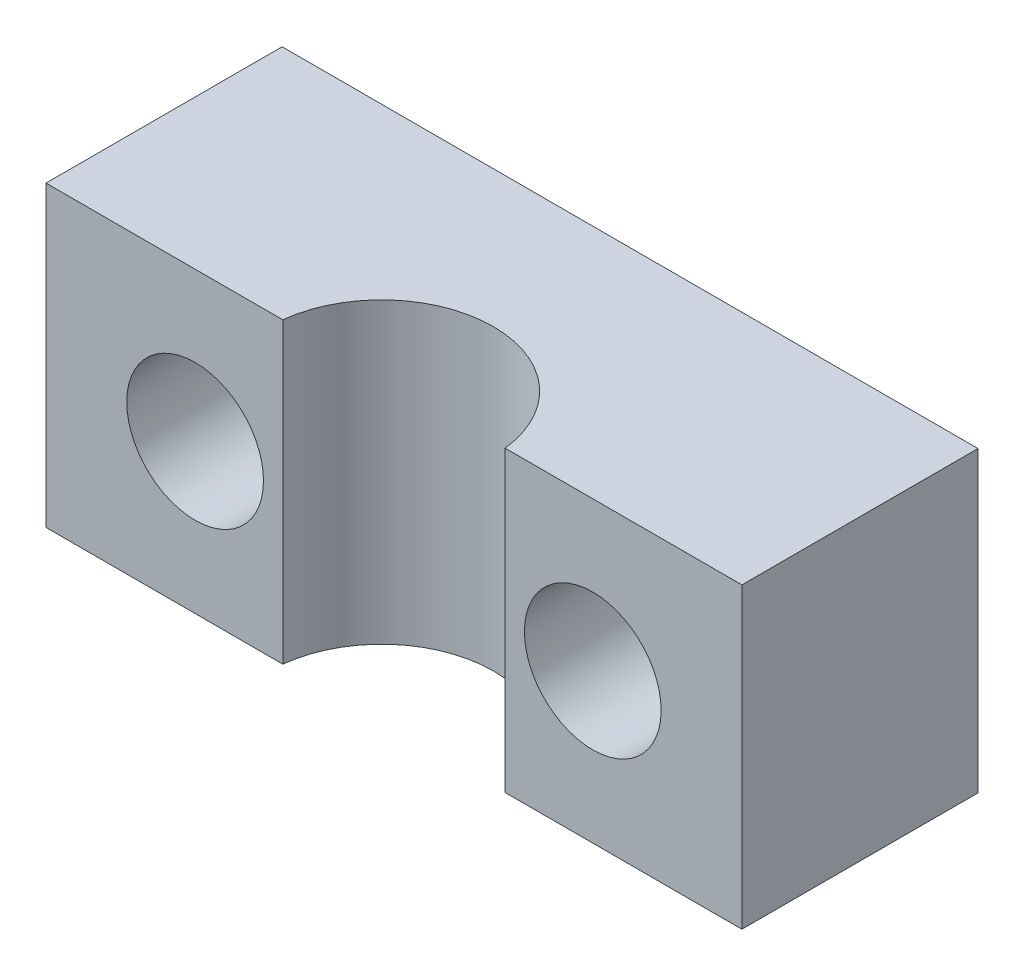
ISO-10303-21;
HEADER;
FILE_DESCRIPTION(('STEP AP214'),'2;1');
FILE_NAME('part.step','',(''),(''),'','','');
FILE_SCHEMA(('AUTOMOTIVE_DESIGN { 1 0 10303 214 1 1 1 1 }'));
ENDSEC;
DATA;
#1=APPLICATION_CONTEXT('core data for automotive mechanical design processes');
#2=APPLICATION_PROTOCOL_DEFINITION('international standard','automotive_design',2000,#1);
#3=PRODUCT_CONTEXT('',#1,'mechanical');
#4=PRODUCT('Part','Part','',(#3));
#5=PRODUCT_RELATED_PRODUCT_CATEGORY('part','',(#4));
#6=PRODUCT_DEFINITION_FORMATION('','',#4);
#7=PRODUCT_DEFINITION_CONTEXT('part definition',#1,'design');
#8=PRODUCT_DEFINITION('design','',#6,#7);
#9=PRODUCT_DEFINITION_SHAPE('','',#8);
#10=(LENGTH_UNIT() NAMED_UNIT(*) SI_UNIT(.MILLI.,.METRE.));
#11=(NAMED_UNIT(*) PLANE_ANGLE_UNIT() SI_UNIT($,.RADIAN.));
#12=(NAMED_UNIT(*) SI_UNIT($,.STERADIAN.) SOLID_ANGLE_UNIT());
#13=UNCERTAINTY_MEASURE_WITH_UNIT(LENGTH_MEASURE(1.E-05),#10,'distance_accuracy_value','');
#14=(GEOMETRIC_REPRESENTATION_CONTEXT(3) GLOBAL_UNCERTAINTY_ASSIGNED_CONTEXT((#13)) GLOBAL_UNIT_ASSIGNED_CONTEXT((#10,
#11,#12)) REPRESENTATION_CONTEXT('',''));
#15=CARTESIAN_POINT('',(0.,0.,0.));
#16=DIRECTION('',(0.,0.,1.));
#17=DIRECTION('',(1.,0.,0.));
#18=AXIS2_PLACEMENT_3D('',#15,#16,#17);
#19=CARTESIAN_POINT('',(1280.16121766258,1004.15899130711,9.5));
#20=DIRECTION('',(0.,0.,1.));
#21=DIRECTION('',(1.,0.,0.));
#22=AXIS2_PLACEMENT_3D('',#19,#20,#21);
#23=PLANE('',#22);
#24=DIRECTION('',(0.,1.,0.));
#25=VECTOR('',#24,1.);
#26=CARTESIAN_POINT('',(1270.63335361758,1004.15899130711,9.5));
#27=LINE('',#26,#25);
#28=CARTESIAN_POINT('',(1270.63335361758,1004.15899130711,9.49999999999998));
#29=VERTEX_POINT('',#28);
#30=CARTESIAN_POINT('',(1270.63335361758,1016.15899130711,9.5));
#31=VERTEX_POINT('',#30);
#32=EDGE_CURVE('E49',#29,#31,#27,.T.);
#33=ORIENTED_EDGE('',*,*,#32,.F.);
#34=DIRECTION('',(1.,0.,0.));
#35=VECTOR('',#34,1.);
#36=CARTESIAN_POINT('',(1252.16121766258,1004.15899130711,9.5));
#37=LINE('',#36,#35);
#38=CARTESIAN_POINT('',(1280.16121766258,1004.15899130711,9.5));
#39=VERTEX_POINT('',#38);
#40=EDGE_CURVE('E86',#29,#39,#37,.T.);
#41=ORIENTED_EDGE('',*,*,#40,.T.);
#42=DIRECTION('',(0.,1.,0.));
#43=VECTOR('',#42,1.);
#44=CARTESIAN_POINT('',(1280.16121766258,1004.15899130711,9.5));
#45=LINE('',#44,#43);
#46=CARTESIAN_POINT('',(1280.16121766258,1016.15899130711,9.5));
#47=VERTEX_POINT('',#46);
#48=EDGE_CURVE('E113',#39,#47,#45,.T.);
#49=ORIENTED_EDGE('',*,*,#48,.T.);
#50=DIRECTION('',(-1.,0.,0.));
#51=VECTOR('',#50,1.);
#52=CARTESIAN_POINT('',(1252.16121766258,1016.15899130711,9.5));
#53=LINE('',#52,#51);
#54=EDGE_CURVE('E106',#47,#31,#53,.T.);
#55=ORIENTED_EDGE('',*,*,#54,.T.);
#56=EDGE_LOOP('',(#33,#41,#49,#55));
#57=FACE_BOUND('',#56,.T.);
#58=CARTESIAN_POINT('',(1274.16121766258,1010.15899130711,9.5));
#59=DIRECTION('',(0.,0.,1.));
#60=DIRECTION('',(1.,0.,0.));
#61=AXIS2_PLACEMENT_3D('',#58,#59,#60);
#62=CIRCLE('',#61,2.75000000000003);
#63=CARTESIAN_POINT('',(1276.91121766258,1010.15899130711,9.5));
#64=VERTEX_POINT('',#63);
#65=EDGE_CURVE('E118',#64,#64,#62,.T.);
#66=ORIENTED_EDGE('',*,*,#65,.F.);
#67=EDGE_LOOP('',(#66));
#68=FACE_BOUND('',#67,.T.);
#69=ADVANCED_FACE('F32',(#57,#68),#23,.T.);
#70=CARTESIAN_POINT('',(1274.16121766258,1010.15899130711,9.5));
#71=DIRECTION('',(0.,0.,-1.));
#72=DIRECTION('',(-1.,0.,0.));
#73=AXIS2_PLACEMENT_3D('',#70,#71,#72);
#74=CYLINDRICAL_SURFACE('',#73,2.75000000000003);
#75=ORIENTED_EDGE('',*,*,#65,.T.);
#76=EDGE_LOOP('',(#75));
#77=FACE_BOUND('',#76,.T.);
#78=CARTESIAN_POINT('',(1274.16121766258,1010.15899130711,5.));
#79=DIRECTION('',(0.,0.,-1.));
#80=DIRECTION('',(-1.,0.,0.));
#81=AXIS2_PLACEMENT_3D('',#78,#79,#80);
#82=CIRCLE('',#81,2.75000000000003);
#83=CARTESIAN_POINT('',(1271.41121766258,1010.15899130711,5.));
#84=VERTEX_POINT('',#83);
#85=EDGE_CURVE('E36',#84,#84,#82,.T.);
#86=ORIENTED_EDGE('',*,*,#85,.T.);
#87=EDGE_LOOP('',(#86));
#88=FACE_BOUND('',#87,.T.);
#89=ADVANCED_FACE('F176',(#77,#88),#74,.F.);
#90=CARTESIAN_POINT('',(1258.16121766258,1010.15899130711,9.5));
#91=DIRECTION('',(0.,0.,-1.));
#92=DIRECTION('',(-1.,0.,0.));
#93=AXIS2_PLACEMENT_3D('',#90,#91,#92);
#94=CYLINDRICAL_SURFACE('',#93,2.75000000000003);
#95=CARTESIAN_POINT('',(1258.16121766258,1010.15899130711,9.5));
#96=DIRECTION('',(0.,0.,1.));
#97=DIRECTION('',(1.,0.,0.));
#98=AXIS2_PLACEMENT_3D('',#95,#96,#97);
#99=CIRCLE('',#98,2.75000000000003);
#100=CARTESIAN_POINT('',(1260.91121766258,1010.15899130711,9.5));
#101=VERTEX_POINT('',#100);
#102=EDGE_CURVE('E136',#101,#101,#99,.T.);
#103=ORIENTED_EDGE('',*,*,#102,.T.);
#104=EDGE_LOOP('',(#103));
#105=FACE_BOUND('',#104,.T.);
#106=CARTESIAN_POINT('',(1258.16121766258,1010.15899130711,5.));
#107=DIRECTION('',(0.,0.,-1.));
#108=DIRECTION('',(-1.,0.,0.));
#109=AXIS2_PLACEMENT_3D('',#106,#107,#108);
#110=CIRCLE('',#109,2.75000000000003);
#111=CARTESIAN_POINT('',(1255.41121766258,1010.15899130711,5.));
#112=VERTEX_POINT('',#111);
#113=EDGE_CURVE('E134',#112,#112,#110,.T.);
#114=ORIENTED_EDGE('',*,*,#113,.T.);
#115=EDGE_LOOP('',(#114));
#116=FACE_BOUND('',#115,.T.);
#117=ADVANCED_FACE('F181',(#105,#116),#94,.F.);
#118=DIRECTION('',(0.,1.,0.));
#119=VECTOR('',#118,1.);
#120=CARTESIAN_POINT('',(1261.68908170758,1004.15899130711,9.5));
#121=LINE('',#120,#119);
#122=CARTESIAN_POINT('',(1261.68908170758,1016.15899130711,9.49999999999998));
#123=VERTEX_POINT('',#122);
#124=CARTESIAN_POINT('',(1261.68908170758,1004.15899130711,9.49999999999998));
#125=VERTEX_POINT('',#124);
#126=EDGE_CURVE('E98',#123,#125,#121,.F.);
#127=ORIENTED_EDGE('',*,*,#126,.F.);
#128=CARTESIAN_POINT('',(1252.16121766258,1016.15899130711,9.5));
#129=VERTEX_POINT('',#128);
#130=EDGE_CURVE('E121',#123,#129,#53,.T.);
#131=ORIENTED_EDGE('',*,*,#130,.T.);
#132=DIRECTION('',(0.,-1.,0.));
#133=VECTOR('',#132,1.);
#134=CARTESIAN_POINT('',(1252.16121766258,1004.15899130711,9.5));
#135=LINE('',#134,#133);
#136=CARTESIAN_POINT('',(1252.16121766258,1004.15899130711,9.5));
#137=VERTEX_POINT('',#136);
#138=EDGE_CURVE('E58',#129,#137,#135,.T.);
#139=ORIENTED_EDGE('',*,*,#138,.T.);
#140=EDGE_CURVE('E111',#137,#125,#37,.T.);
#141=ORIENTED_EDGE('',*,*,#140,.T.);
#142=EDGE_LOOP('',(#127,#131,#139,#141));
#143=FACE_BOUND('',#142,.T.);
#144=ORIENTED_EDGE('',*,*,#102,.F.);
#145=EDGE_LOOP('',(#144));
#146=FACE_BOUND('',#145,.T.);
#147=ADVANCED_FACE('F157',(#143,#146),#23,.T.);
#148=CARTESIAN_POINT('',(1280.16121766258,1004.15899130711,0.));
#149=DIRECTION('',(0.,0.,1.));
#150=DIRECTION('',(1.,0.,0.));
#151=AXIS2_PLACEMENT_3D('',#148,#149,#150);
#152=PLANE('',#151);
#153=CARTESIAN_POINT('',(1274.16121766258,1010.15899130711,0.));
#154=DIRECTION('',(0.,0.,-1.));
#155=DIRECTION('',(-1.,0.,0.));
#156=AXIS2_PLACEMENT_3D('',#153,#154,#155);
#157=CIRCLE('',#156,4.75000000000002);
#158=CARTESIAN_POINT('',(1269.41121766258,1010.15899130711,0.));
#159=VERTEX_POINT('',#158);
#160=EDGE_CURVE('E107',#159,#159,#157,.T.);
#161=ORIENTED_EDGE('',*,*,#160,.F.);
#162=EDGE_LOOP('',(#161));
#163=FACE_BOUND('',#162,.T.);
#164=CARTESIAN_POINT('',(1258.16121766258,1010.15899130711,0.));
#165=DIRECTION('',(0.,0.,-1.));
#166=DIRECTION('',(-1.,0.,0.));
#167=AXIS2_PLACEMENT_3D('',#164,#165,#166);
#168=CIRCLE('',#167,4.75000000000002);
#169=CARTESIAN_POINT('',(1253.41121766258,1010.15899130711,0.));
#170=VERTEX_POINT('',#169);
#171=EDGE_CURVE('E142',#170,#170,#168,.T.);
#172=ORIENTED_EDGE('',*,*,#171,.F.);
#173=EDGE_LOOP('',(#172));
#174=FACE_BOUND('',#173,.T.);
#175=DIRECTION('',(1.,0.,0.));
#176=VECTOR('',#175,1.);
#177=CARTESIAN_POINT('',(1252.16121766258,1004.15899130711,0.));
#178=LINE('',#177,#176);
#179=CARTESIAN_POINT('',(1252.16121766258,1004.15899130711,0.));
#180=VERTEX_POINT('',#179);
#181=CARTESIAN_POINT('',(1280.16121766258,1004.15899130711,0.));
#182=VERTEX_POINT('',#181);
#183=EDGE_CURVE('E125',#180,#182,#178,.T.);
#184=ORIENTED_EDGE('',*,*,#183,.F.);
#185=DIRECTION('',(0.,-1.,0.));
#186=VECTOR('',#185,1.);
#187=CARTESIAN_POINT('',(1252.16121766258,1004.15899130711,0.));
#188=LINE('',#187,#186);
#189=CARTESIAN_POINT('',(1252.16121766258,1016.15899130711,0.));
#190=VERTEX_POINT('',#189);
#191=EDGE_CURVE('E79',#190,#180,#188,.T.);
#192=ORIENTED_EDGE('',*,*,#191,.F.);
#193=DIRECTION('',(-1.,0.,0.));
#194=VECTOR('',#193,1.);
#195=CARTESIAN_POINT('',(1252.16121766258,1016.15899130711,0.));
#196=LINE('',#195,#194);
#197=CARTESIAN_POINT('',(1280.16121766258,1016.15899130711,0.));
#198=VERTEX_POINT('',#197);
#199=EDGE_CURVE('E114',#198,#190,#196,.T.);
#200=ORIENTED_EDGE('',*,*,#199,.F.);
#201=DIRECTION('',(0.,1.,0.));
#202=VECTOR('',#201,1.);
#203=CARTESIAN_POINT('',(1280.16121766258,1004.15899130711,0.));
#204=LINE('',#203,#202);
#205=EDGE_CURVE('E127',#182,#198,#204,.T.);
#206=ORIENTED_EDGE('',*,*,#205,.F.);
#207=EDGE_LOOP('',(#184,#192,#200,#206));
#208=FACE_BOUND('',#207,.T.);
#209=ADVANCED_FACE('F165',(#163,#174,#208),#152,.F.);
#210=CARTESIAN_POINT('',(1252.16121766258,1004.15899130711,9.5));
#211=DIRECTION('',(0.,1.,0.));
#212=DIRECTION('',(0.,0.,1.));
#213=AXIS2_PLACEMENT_3D('',#210,#211,#212);
#214=PLANE('',#213);
#215=ORIENTED_EDGE('',*,*,#40,.F.);
#216=CARTESIAN_POINT('',(1266.16121766258,1004.15899130711,10.));
#217=DIRECTION('',(0.,1.,0.));
#218=DIRECTION('',(0.,0.,1.));
#219=AXIS2_PLACEMENT_3D('',#216,#217,#218);
#220=CIRCLE('',#219,4.50000000000001);
#221=EDGE_CURVE('E95',#29,#125,#220,.T.);
#222=ORIENTED_EDGE('',*,*,#221,.T.);
#223=ORIENTED_EDGE('',*,*,#140,.F.);
#224=DIRECTION('',(0.,0.,-1.));
#225=VECTOR('',#224,1.);
#226=CARTESIAN_POINT('',(1252.16121766258,1004.15899130711,9.5));
#227=LINE('',#226,#225);
#228=EDGE_CURVE('E124',#137,#180,#227,.T.);
#229=ORIENTED_EDGE('',*,*,#228,.T.);
#230=ORIENTED_EDGE('',*,*,#183,.T.);
#231=DIRECTION('',(0.,0.,-1.));
#232=VECTOR('',#231,1.);
#233=CARTESIAN_POINT('',(1280.16121766258,1004.15899130711,9.5));
#234=LINE('',#233,#232);
#235=EDGE_CURVE('E11',#39,#182,#234,.T.);
#236=ORIENTED_EDGE('',*,*,#235,.F.);
#237=EDGE_LOOP('',(#215,#222,#223,#229,#230,#236));
#238=FACE_BOUND('',#237,.T.);
#239=ADVANCED_FACE('F34',(#238),#214,.F.);
#240=CARTESIAN_POINT('',(1280.16121766258,1004.15899130711,9.5));
#241=DIRECTION('',(-1.,0.,0.));
#242=DIRECTION('',(0.,-1.,0.));
#243=AXIS2_PLACEMENT_3D('',#240,#241,#242);
#244=PLANE('',#243);
#245=ORIENTED_EDGE('',*,*,#205,.T.);
#246=DIRECTION('',(0.,0.,-1.));
#247=VECTOR('',#246,1.);
#248=CARTESIAN_POINT('',(1280.16121766258,1016.15899130711,9.5));
#249=LINE('',#248,#247);
#250=EDGE_CURVE('E41',#47,#198,#249,.T.);
#251=ORIENTED_EDGE('',*,*,#250,.F.);
#252=ORIENTED_EDGE('',*,*,#48,.F.);
#253=ORIENTED_EDGE('',*,*,#235,.T.);
#254=EDGE_LOOP('',(#245,#251,#252,#253));
#255=FACE_BOUND('',#254,.T.);
#256=ADVANCED_FACE('F168',(#255),#244,.F.);
#257=CARTESIAN_POINT('',(1252.16121766258,1016.15899130711,9.5));
#258=DIRECTION('',(0.,-1.,0.));
#259=DIRECTION('',(0.,0.,-1.));
#260=AXIS2_PLACEMENT_3D('',#257,#258,#259);
#261=PLANE('',#260);
#262=ORIENTED_EDGE('',*,*,#130,.F.);
#263=CARTESIAN_POINT('',(1266.16121766258,1016.15899130711,10.));
#264=DIRECTION('',(0.,1.,0.));
#265=DIRECTION('',(0.,0.,1.));
#266=AXIS2_PLACEMENT_3D('',#263,#264,#265);
#267=CIRCLE('',#266,4.50000000000001);
#268=EDGE_CURVE('E101',#31,#123,#267,.T.);
#269=ORIENTED_EDGE('',*,*,#268,.F.);
#270=ORIENTED_EDGE('',*,*,#54,.F.);
#271=ORIENTED_EDGE('',*,*,#250,.T.);
#272=ORIENTED_EDGE('',*,*,#199,.T.);
#273=DIRECTION('',(0.,0.,-1.));
#274=VECTOR('',#273,1.);
#275=CARTESIAN_POINT('',(1252.16121766258,1016.15899130711,9.5));
#276=LINE('',#275,#274);
#277=EDGE_CURVE('E131',#129,#190,#276,.T.);
#278=ORIENTED_EDGE('',*,*,#277,.F.);
#279=EDGE_LOOP('',(#262,#269,#270,#271,#272,#278));
#280=FACE_BOUND('',#279,.T.);
#281=ADVANCED_FACE('F160',(#280),#261,.F.);
#282=CARTESIAN_POINT('',(1252.16121766258,1004.15899130711,9.5));
#283=DIRECTION('',(1.,0.,0.));
#284=DIRECTION('',(0.,0.,-1.));
#285=AXIS2_PLACEMENT_3D('',#282,#283,#284);
#286=PLANE('',#285);
#287=ORIENTED_EDGE('',*,*,#191,.T.);
#288=ORIENTED_EDGE('',*,*,#228,.F.);
#289=ORIENTED_EDGE('',*,*,#138,.F.);
#290=ORIENTED_EDGE('',*,*,#277,.T.);
#291=EDGE_LOOP('',(#287,#288,#289,#290));
#292=FACE_BOUND('',#291,.T.);
#293=ADVANCED_FACE('F162',(#292),#286,.F.);
#294=CARTESIAN_POINT('',(1258.16121766258,1010.15899130711,5.));
#295=DIRECTION('',(0.,0.,-1.));
#296=DIRECTION('',(-1.,0.,0.));
#297=AXIS2_PLACEMENT_3D('',#294,#295,#296);
#298=CYLINDRICAL_SURFACE('',#297,4.75000000000002);
#299=CARTESIAN_POINT('',(1258.16121766258,1010.15899130711,5.));
#300=DIRECTION('',(0.,0.,-1.));
#301=DIRECTION('',(-1.,0.,0.));
#302=AXIS2_PLACEMENT_3D('',#299,#300,#301);
#303=CIRCLE('',#302,4.75000000000002);
#304=CARTESIAN_POINT('',(1253.41121766258,1010.15899130711,5.));
#305=VERTEX_POINT('',#304);
#306=EDGE_CURVE('E137',#305,#305,#303,.T.);
#307=ORIENTED_EDGE('',*,*,#306,.F.);
#308=EDGE_LOOP('',(#307));
#309=FACE_BOUND('',#308,.T.);
#310=ORIENTED_EDGE('',*,*,#171,.T.);
#311=EDGE_LOOP('',(#310));
#312=FACE_BOUND('',#311,.T.);
#313=ADVANCED_FACE('F196',(#309,#312),#298,.F.);
#314=CARTESIAN_POINT('',(1258.16121766258,1010.15899130711,5.));
#315=DIRECTION('',(0.,0.,-1.));
#316=DIRECTION('',(-1.,0.,0.));
#317=AXIS2_PLACEMENT_3D('',#314,#315,#316);
#318=PLANE('',#317);
#319=ORIENTED_EDGE('',*,*,#113,.F.);
#320=EDGE_LOOP('',(#319));
#321=FACE_BOUND('',#320,.T.);
#322=ORIENTED_EDGE('',*,*,#306,.T.);
#323=EDGE_LOOP('',(#322));
#324=FACE_BOUND('',#323,.T.);
#325=ADVANCED_FACE('F199',(#321,#324),#318,.T.);
#326=CARTESIAN_POINT('',(1274.16121766258,1010.15899130711,5.));
#327=DIRECTION('',(0.,0.,-1.));
#328=DIRECTION('',(-1.,0.,0.));
#329=AXIS2_PLACEMENT_3D('',#326,#327,#328);
#330=CYLINDRICAL_SURFACE('',#329,4.75000000000002);
#331=CARTESIAN_POINT('',(1274.16121766258,1010.15899130711,5.));
#332=DIRECTION('',(0.,0.,-1.));
#333=DIRECTION('',(-1.,0.,0.));
#334=AXIS2_PLACEMENT_3D('',#331,#332,#333);
#335=CIRCLE('',#334,4.75000000000002);
#336=CARTESIAN_POINT('',(1269.41121766258,1010.15899130711,5.));
#337=VERTEX_POINT('',#336);
#338=EDGE_CURVE('E151',#337,#337,#335,.T.);
#339=ORIENTED_EDGE('',*,*,#338,.F.);
#340=EDGE_LOOP('',(#339));
#341=FACE_BOUND('',#340,.T.);
#342=ORIENTED_EDGE('',*,*,#160,.T.);
#343=EDGE_LOOP('',(#342));
#344=FACE_BOUND('',#343,.T.);
#345=ADVANCED_FACE('F203',(#341,#344),#330,.F.);
#346=CARTESIAN_POINT('',(1274.16121766258,1010.15899130711,5.));
#347=DIRECTION('',(0.,0.,-1.));
#348=DIRECTION('',(-1.,0.,0.));
#349=AXIS2_PLACEMENT_3D('',#346,#347,#348);
#350=PLANE('',#349);
#351=ORIENTED_EDGE('',*,*,#85,.F.);
#352=EDGE_LOOP('',(#351));
#353=FACE_BOUND('',#352,.T.);
#354=ORIENTED_EDGE('',*,*,#338,.T.);
#355=EDGE_LOOP('',(#354));
#356=FACE_BOUND('',#355,.T.);
#357=ADVANCED_FACE('F207',(#353,#356),#350,.T.);
#358=CARTESIAN_POINT('',(1266.16121766258,1004.15899130711,10.));
#359=DIRECTION('',(0.,1.,0.));
#360=DIRECTION('',(0.,0.,1.));
#361=AXIS2_PLACEMENT_3D('',#358,#359,#360);
#362=CYLINDRICAL_SURFACE('',#361,4.50000000000001);
#363=ORIENTED_EDGE('',*,*,#32,.T.);
#364=ORIENTED_EDGE('',*,*,#268,.T.);
#365=ORIENTED_EDGE('',*,*,#126,.T.);
#366=ORIENTED_EDGE('',*,*,#221,.F.);
#367=EDGE_LOOP('',(#363,#364,#365,#366));
#368=FACE_BOUND('',#367,.T.);
#369=ADVANCED_FACE('F96',(#368),#362,.F.);
#370=CLOSED_SHELL('',(#69,#89,#117,#147,#209,#239,#256,#281,#293,#313,#325,#345,#357,#369));
#371=MANIFOLD_SOLID_BREP('B2',#370);
#372=ADVANCED_BREP_SHAPE_REPRESENTATION('',(#18,#371),#14);
#373=SHAPE_DEFINITION_REPRESENTATION(#9,#372);
ENDSEC;
END-ISO-10303-21;
